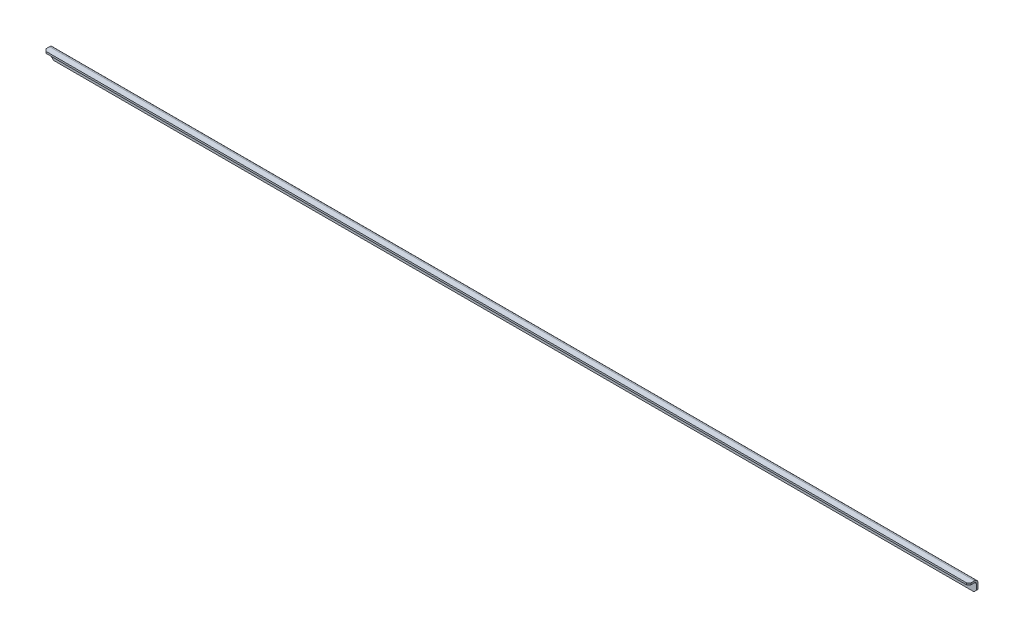
ISO-10303-21;
HEADER;
FILE_DESCRIPTION(('STEP AP214'),'2;1');
FILE_NAME('part.step','',(''),(''),'','','');
FILE_SCHEMA(('AUTOMOTIVE_DESIGN { 1 0 10303 214 1 1 1 1 }'));
ENDSEC;
DATA;
#1=APPLICATION_CONTEXT('core data for automotive mechanical design processes');
#2=APPLICATION_PROTOCOL_DEFINITION('international standard','automotive_design',2000,#1);
#3=PRODUCT_CONTEXT('',#1,'mechanical');
#4=PRODUCT('Part','Part','',(#3));
#5=PRODUCT_RELATED_PRODUCT_CATEGORY('part','',(#4));
#6=PRODUCT_DEFINITION_FORMATION('','',#4);
#7=PRODUCT_DEFINITION_CONTEXT('part definition',#1,'design');
#8=PRODUCT_DEFINITION('design','',#6,#7);
#9=PRODUCT_DEFINITION_SHAPE('','',#8);
#10=(LENGTH_UNIT() NAMED_UNIT(*) SI_UNIT(.MILLI.,.METRE.));
#11=(NAMED_UNIT(*) PLANE_ANGLE_UNIT() SI_UNIT($,.RADIAN.));
#12=(NAMED_UNIT(*) SI_UNIT($,.STERADIAN.) SOLID_ANGLE_UNIT());
#13=UNCERTAINTY_MEASURE_WITH_UNIT(LENGTH_MEASURE(1.E-05),#10,'distance_accuracy_value','');
#14=(GEOMETRIC_REPRESENTATION_CONTEXT(3) GLOBAL_UNCERTAINTY_ASSIGNED_CONTEXT((#13)) GLOBAL_UNIT_ASSIGNED_CONTEXT((#10,
#11,#12)) REPRESENTATION_CONTEXT('',''));
#15=CARTESIAN_POINT('',(0.,0.,0.));
#16=DIRECTION('',(0.,0.,1.));
#17=DIRECTION('',(1.,0.,0.));
#18=AXIS2_PLACEMENT_3D('',#15,#16,#17);
#19=CARTESIAN_POINT('',(800.,0.,1.5));
#20=DIRECTION('',(0.,1.,0.));
#21=DIRECTION('',(0.,0.,1.));
#22=AXIS2_PLACEMENT_3D('',#19,#20,#21);
#23=PLANE('',#22);
#24=DIRECTION('',(-1.,0.,0.));
#25=VECTOR('',#24,1.);
#26=CARTESIAN_POINT('',(800.,0.,0.));
#27=LINE('',#26,#25);
#28=CARTESIAN_POINT('',(798.,0.,0.));
#29=VERTEX_POINT('',#28);
#30=CARTESIAN_POINT('',(2.00000000000025,0.,0.));
#31=VERTEX_POINT('',#30);
#32=EDGE_CURVE('E140',#29,#31,#27,.T.);
#33=ORIENTED_EDGE('',*,*,#32,.F.);
#34=DIRECTION('',(0.,0.,1.));
#35=VECTOR('',#34,1.);
#36=CARTESIAN_POINT('',(798.,0.,1.5));
#37=LINE('',#36,#35);
#38=CARTESIAN_POINT('',(798.,0.,1.5));
#39=VERTEX_POINT('',#38);
#40=EDGE_CURVE('E195',#29,#39,#37,.T.);
#41=ORIENTED_EDGE('',*,*,#40,.T.);
#42=DIRECTION('',(-1.,0.,0.));
#43=VECTOR('',#42,1.);
#44=CARTESIAN_POINT('',(800.,0.,1.5));
#45=LINE('',#44,#43);
#46=CARTESIAN_POINT('',(2.00000000000025,0.,1.5));
#47=VERTEX_POINT('',#46);
#48=EDGE_CURVE('E157',#39,#47,#45,.T.);
#49=ORIENTED_EDGE('',*,*,#48,.T.);
#50=DIRECTION('',(0.,0.,-1.));
#51=VECTOR('',#50,1.);
#52=CARTESIAN_POINT('',(2.,0.,1.5));
#53=LINE('',#52,#51);
#54=EDGE_CURVE('E192',#47,#31,#53,.T.);
#55=ORIENTED_EDGE('',*,*,#54,.T.);
#56=EDGE_LOOP('',(#33,#41,#49,#55));
#57=FACE_BOUND('',#56,.T.);
#58=ADVANCED_FACE('F34',(#57),#23,.F.);
#59=CARTESIAN_POINT('',(800.,0.,0.));
#60=DIRECTION('',(0.,0.,1.));
#61=DIRECTION('',(1.,0.,0.));
#62=AXIS2_PLACEMENT_3D('',#59,#60,#61);
#63=PLANE('',#62);
#64=DIRECTION('',(0.,1.,0.));
#65=VECTOR('',#64,1.);
#66=CARTESIAN_POINT('',(800.,0.,0.));
#67=LINE('',#66,#65);
#68=CARTESIAN_POINT('',(800.,2.,0.));
#69=VERTEX_POINT('',#68);
#70=CARTESIAN_POINT('',(800.,7.,0.));
#71=VERTEX_POINT('',#70);
#72=EDGE_CURVE('E156',#69,#71,#67,.T.);
#73=ORIENTED_EDGE('',*,*,#72,.F.);
#74=DIRECTION('',(-0.707106781186567,-0.707106781186528,0.));
#75=VECTOR('',#74,1.);
#76=CARTESIAN_POINT('',(800.,2.,0.));
#77=LINE('',#76,#75);
#78=EDGE_CURVE('E190',#69,#29,#77,.T.);
#79=ORIENTED_EDGE('',*,*,#78,.T.);
#80=ORIENTED_EDGE('',*,*,#32,.T.);
#81=DIRECTION('',(0.707106781186528,-0.707106781186567,0.));
#82=VECTOR('',#81,1.);
#83=CARTESIAN_POINT('',(2.,0.,0.));
#84=LINE('',#83,#82);
#85=CARTESIAN_POINT('',(0.,2.00000000000011,0.));
#86=VERTEX_POINT('',#85);
#87=EDGE_CURVE('E188',#31,#86,#84,.F.);
#88=ORIENTED_EDGE('',*,*,#87,.T.);
#89=DIRECTION('',(0.,1.,0.));
#90=VECTOR('',#89,1.);
#91=CARTESIAN_POINT('',(0.,0.,0.));
#92=LINE('',#91,#90);
#93=CARTESIAN_POINT('',(0.,7.,0.));
#94=VERTEX_POINT('',#93);
#95=EDGE_CURVE('E147',#86,#94,#92,.T.);
#96=ORIENTED_EDGE('',*,*,#95,.T.);
#97=DIRECTION('',(-1.,0.,0.));
#98=VECTOR('',#97,1.);
#99=CARTESIAN_POINT('',(800.,7.,0.));
#100=LINE('',#99,#98);
#101=EDGE_CURVE('E130',#94,#71,#100,.F.);
#102=ORIENTED_EDGE('',*,*,#101,.T.);
#103=EDGE_LOOP('',(#73,#79,#80,#88,#96,#102));
#104=FACE_BOUND('',#103,.T.);
#105=ADVANCED_FACE('F240',(#104),#63,.F.);
#106=CARTESIAN_POINT('',(800.,10.,0.));
#107=DIRECTION('',(0.,-1.,0.));
#108=DIRECTION('',(0.,0.,-1.));
#109=AXIS2_PLACEMENT_3D('',#106,#107,#108);
#110=PLANE('',#109);
#111=DIRECTION('',(-1.,0.,0.));
#112=VECTOR('',#111,1.);
#113=CARTESIAN_POINT('',(800.,10.,7.99999999999999));
#114=LINE('',#113,#112);
#115=CARTESIAN_POINT('',(798.,10.,7.99999999999999));
#116=VERTEX_POINT('',#115);
#117=CARTESIAN_POINT('',(2.00000000000025,10.,8.00000000000008));
#118=VERTEX_POINT('',#117);
#119=EDGE_CURVE('E164',#116,#118,#114,.T.);
#120=ORIENTED_EDGE('',*,*,#119,.F.);
#121=DIRECTION('',(0.707106781186567,0.,-0.707106781186528));
#122=VECTOR('',#121,1.);
#123=CARTESIAN_POINT('',(800.,10.,5.99999999999999));
#124=LINE('',#123,#122);
#125=CARTESIAN_POINT('',(800.,10.,5.99999999999999));
#126=VERTEX_POINT('',#125);
#127=EDGE_CURVE('E11',#116,#126,#124,.T.);
#128=ORIENTED_EDGE('',*,*,#127,.T.);
#129=DIRECTION('',(0.,0.,1.));
#130=VECTOR('',#129,1.);
#131=CARTESIAN_POINT('',(800.,10.,0.));
#132=LINE('',#131,#130);
#133=CARTESIAN_POINT('',(800.,10.,3.));
#134=VERTEX_POINT('',#133);
#135=EDGE_CURVE('E139',#134,#126,#132,.T.);
#136=ORIENTED_EDGE('',*,*,#135,.F.);
#137=DIRECTION('',(-1.,0.,0.));
#138=VECTOR('',#137,1.);
#139=CARTESIAN_POINT('',(800.,10.,3.));
#140=LINE('',#139,#138);
#141=CARTESIAN_POINT('',(0.,10.,3.));
#142=VERTEX_POINT('',#141);
#143=EDGE_CURVE('E128',#134,#142,#140,.T.);
#144=ORIENTED_EDGE('',*,*,#143,.T.);
#145=DIRECTION('',(0.,0.,1.));
#146=VECTOR('',#145,1.);
#147=CARTESIAN_POINT('',(0.,10.,0.));
#148=LINE('',#147,#146);
#149=CARTESIAN_POINT('',(0.,10.,5.99999999999988));
#150=VERTEX_POINT('',#149);
#151=EDGE_CURVE('E137',#142,#150,#148,.T.);
#152=ORIENTED_EDGE('',*,*,#151,.T.);
#153=DIRECTION('',(-0.707106781186528,0.,-0.707106781186567));
#154=VECTOR('',#153,1.);
#155=CARTESIAN_POINT('',(2.,10.,7.99999999999999));
#156=LINE('',#155,#154);
#157=EDGE_CURVE('E42',#150,#118,#156,.F.);
#158=ORIENTED_EDGE('',*,*,#157,.T.);
#159=EDGE_LOOP('',(#120,#128,#136,#144,#152,#158));
#160=FACE_BOUND('',#159,.T.);
#161=ADVANCED_FACE('F136',(#160),#110,.F.);
#162=CARTESIAN_POINT('',(800.,10.,7.99999999999999));
#163=DIRECTION('',(0.,0.,-1.));
#164=DIRECTION('',(-1.,0.,0.));
#165=AXIS2_PLACEMENT_3D('',#162,#163,#164);
#166=PLANE('',#165);
#167=DIRECTION('',(-1.,0.,0.));
#168=VECTOR('',#167,1.);
#169=CARTESIAN_POINT('',(800.,8.49999999999999,7.99999999999999));
#170=LINE('',#169,#168);
#171=CARTESIAN_POINT('',(798.,8.49999999999999,7.99999999999999));
#172=VERTEX_POINT('',#171);
#173=CARTESIAN_POINT('',(2.00000000000025,8.49999999999999,8.00000000000008));
#174=VERTEX_POINT('',#173);
#175=EDGE_CURVE('E160',#172,#174,#170,.T.);
#176=ORIENTED_EDGE('',*,*,#175,.F.);
#177=DIRECTION('',(0.,1.,0.));
#178=VECTOR('',#177,1.);
#179=CARTESIAN_POINT('',(798.,10.,7.99999999999999));
#180=LINE('',#179,#178);
#181=EDGE_CURVE('E55',#172,#116,#180,.T.);
#182=ORIENTED_EDGE('',*,*,#181,.T.);
#183=ORIENTED_EDGE('',*,*,#119,.T.);
#184=DIRECTION('',(0.,-1.,0.));
#185=VECTOR('',#184,1.);
#186=CARTESIAN_POINT('',(2.,10.,7.99999999999999));
#187=LINE('',#186,#185);
#188=EDGE_CURVE('E208',#118,#174,#187,.T.);
#189=ORIENTED_EDGE('',*,*,#188,.T.);
#190=EDGE_LOOP('',(#176,#182,#183,#189));
#191=FACE_BOUND('',#190,.T.);
#192=ADVANCED_FACE('F212',(#191),#166,.F.);
#193=CARTESIAN_POINT('',(800.,8.49999999999999,7.99999999999999));
#194=DIRECTION('',(0.,1.,0.));
#195=DIRECTION('',(0.,0.,1.));
#196=AXIS2_PLACEMENT_3D('',#193,#194,#195);
#197=PLANE('',#196);
#198=DIRECTION('',(0.,0.,-1.));
#199=VECTOR('',#198,1.);
#200=CARTESIAN_POINT('',(800.,8.49999999999999,7.99999999999999));
#201=LINE('',#200,#199);
#202=CARTESIAN_POINT('',(800.,8.49999999999999,5.99999999999999));
#203=VERTEX_POINT('',#202);
#204=CARTESIAN_POINT('',(800.,8.49999999999999,3.00000000000001));
#205=VERTEX_POINT('',#204);
#206=EDGE_CURVE('E217',#203,#205,#201,.T.);
#207=ORIENTED_EDGE('',*,*,#206,.F.);
#208=DIRECTION('',(-0.707106781186567,0.,0.707106781186528));
#209=VECTOR('',#208,1.);
#210=CARTESIAN_POINT('',(800.,8.49999999999999,5.99999999999999));
#211=LINE('',#210,#209);
#212=EDGE_CURVE('E206',#203,#172,#211,.T.);
#213=ORIENTED_EDGE('',*,*,#212,.T.);
#214=ORIENTED_EDGE('',*,*,#175,.T.);
#215=DIRECTION('',(0.707106781186528,0.,0.707106781186567));
#216=VECTOR('',#215,1.);
#217=CARTESIAN_POINT('',(2.,8.49999999999999,7.99999999999999));
#218=LINE('',#217,#216);
#219=CARTESIAN_POINT('',(0.,8.49999999999999,5.99999999999988));
#220=VERTEX_POINT('',#219);
#221=EDGE_CURVE('E204',#174,#220,#218,.F.);
#222=ORIENTED_EDGE('',*,*,#221,.T.);
#223=DIRECTION('',(0.,0.,-1.));
#224=VECTOR('',#223,1.);
#225=CARTESIAN_POINT('',(0.,8.49999999999999,7.99999999999999));
#226=LINE('',#225,#224);
#227=CARTESIAN_POINT('',(0.,8.49999999999999,3.00000000000001));
#228=VERTEX_POINT('',#227);
#229=EDGE_CURVE('E146',#220,#228,#226,.T.);
#230=ORIENTED_EDGE('',*,*,#229,.T.);
#231=DIRECTION('',(-1.,0.,0.));
#232=VECTOR('',#231,1.);
#233=CARTESIAN_POINT('',(800.,8.49999999999999,3.00000000000001));
#234=LINE('',#233,#232);
#235=EDGE_CURVE('E174',#228,#205,#234,.F.);
#236=ORIENTED_EDGE('',*,*,#235,.T.);
#237=EDGE_LOOP('',(#207,#213,#214,#222,#230,#236));
#238=FACE_BOUND('',#237,.T.);
#239=ADVANCED_FACE('F216',(#238),#197,.F.);
#240=CARTESIAN_POINT('',(800.,8.49999999999999,1.50000000000001));
#241=DIRECTION('',(0.,0.,-1.));
#242=DIRECTION('',(0.,1.,0.));
#243=AXIS2_PLACEMENT_3D('',#240,#241,#242);
#244=PLANE('',#243);
#245=ORIENTED_EDGE('',*,*,#48,.F.);
#246=DIRECTION('',(0.707106781186567,0.707106781186528,0.));
#247=VECTOR('',#246,1.);
#248=CARTESIAN_POINT('',(800.,2.,1.5));
#249=LINE('',#248,#247);
#250=CARTESIAN_POINT('',(800.,2.,1.5));
#251=VERTEX_POINT('',#250);
#252=EDGE_CURVE('E199',#39,#251,#249,.T.);
#253=ORIENTED_EDGE('',*,*,#252,.T.);
#254=DIRECTION('',(0.,-1.,0.));
#255=VECTOR('',#254,1.);
#256=CARTESIAN_POINT('',(800.,8.49999999999999,1.50000000000001));
#257=LINE('',#256,#255);
#258=CARTESIAN_POINT('',(800.,6.99999999999999,1.50000000000001));
#259=VERTEX_POINT('',#258);
#260=EDGE_CURVE('E161',#259,#251,#257,.T.);
#261=ORIENTED_EDGE('',*,*,#260,.F.);
#262=DIRECTION('',(-1.,0.,0.));
#263=VECTOR('',#262,1.);
#264=CARTESIAN_POINT('',(0.,6.99999999999999,1.50000000000001));
#265=LINE('',#264,#263);
#266=CARTESIAN_POINT('',(0.,6.99999999999999,1.50000000000001));
#267=VERTEX_POINT('',#266);
#268=EDGE_CURVE('E171',#259,#267,#265,.T.);
#269=ORIENTED_EDGE('',*,*,#268,.T.);
#270=DIRECTION('',(0.,-1.,0.));
#271=VECTOR('',#270,1.);
#272=CARTESIAN_POINT('',(0.,8.49999999999999,1.50000000000001));
#273=LINE('',#272,#271);
#274=CARTESIAN_POINT('',(0.,2.00000000000011,1.5));
#275=VERTEX_POINT('',#274);
#276=EDGE_CURVE('E149',#267,#275,#273,.T.);
#277=ORIENTED_EDGE('',*,*,#276,.T.);
#278=DIRECTION('',(-0.707106781186528,0.707106781186567,0.));
#279=VECTOR('',#278,1.);
#280=CARTESIAN_POINT('',(2.,0.,1.5));
#281=LINE('',#280,#279);
#282=EDGE_CURVE('E197',#275,#47,#281,.F.);
#283=ORIENTED_EDGE('',*,*,#282,.T.);
#284=EDGE_LOOP('',(#245,#253,#261,#269,#277,#283));
#285=FACE_BOUND('',#284,.T.);
#286=ADVANCED_FACE('F249',(#285),#244,.F.);
#287=CARTESIAN_POINT('',(800.,0.,0.));
#288=DIRECTION('',(1.,0.,0.));
#289=DIRECTION('',(0.,0.,-1.));
#290=AXIS2_PLACEMENT_3D('',#287,#288,#289);
#291=PLANE('',#290);
#292=ORIENTED_EDGE('',*,*,#260,.T.);
#293=DIRECTION('',(0.,0.,-1.));
#294=VECTOR('',#293,1.);
#295=CARTESIAN_POINT('',(800.,2.,0.));
#296=LINE('',#295,#294);
#297=EDGE_CURVE('E185',#251,#69,#296,.T.);
#298=ORIENTED_EDGE('',*,*,#297,.T.);
#299=ORIENTED_EDGE('',*,*,#72,.T.);
#300=CARTESIAN_POINT('',(800.,7.,3.));
#301=DIRECTION('',(1.,0.,0.));
#302=DIRECTION('',(0.,0.,-1.));
#303=AXIS2_PLACEMENT_3D('',#300,#301,#302);
#304=CIRCLE('',#303,3.);
#305=EDGE_CURVE('E169',#71,#134,#304,.T.);
#306=ORIENTED_EDGE('',*,*,#305,.T.);
#307=ORIENTED_EDGE('',*,*,#135,.T.);
#308=DIRECTION('',(0.,-1.,0.));
#309=VECTOR('',#308,1.);
#310=CARTESIAN_POINT('',(800.,8.49999999999999,5.99999999999999));
#311=LINE('',#310,#309);
#312=EDGE_CURVE('E182',#126,#203,#311,.T.);
#313=ORIENTED_EDGE('',*,*,#312,.T.);
#314=ORIENTED_EDGE('',*,*,#206,.T.);
#315=CARTESIAN_POINT('',(800.,6.99999999999999,3.00000000000001));
#316=DIRECTION('',(1.,0.,0.));
#317=DIRECTION('',(0.,0.,-1.));
#318=AXIS2_PLACEMENT_3D('',#315,#316,#317);
#319=CIRCLE('',#318,1.5);
#320=EDGE_CURVE('E180',#205,#259,#319,.F.);
#321=ORIENTED_EDGE('',*,*,#320,.T.);
#322=EDGE_LOOP('',(#292,#298,#299,#306,#307,#313,#314,#321));
#323=FACE_BOUND('',#322,.T.);
#324=ADVANCED_FACE('F224',(#323),#291,.T.);
#325=CARTESIAN_POINT('',(0.,0.,0.));
#326=DIRECTION('',(1.,0.,0.));
#327=DIRECTION('',(0.,0.,-1.));
#328=AXIS2_PLACEMENT_3D('',#325,#326,#327);
#329=PLANE('',#328);
#330=ORIENTED_EDGE('',*,*,#95,.F.);
#331=DIRECTION('',(0.,0.,1.));
#332=VECTOR('',#331,1.);
#333=CARTESIAN_POINT('',(0.,2.00000000000011,0.));
#334=LINE('',#333,#332);
#335=EDGE_CURVE('E202',#86,#275,#334,.T.);
#336=ORIENTED_EDGE('',*,*,#335,.T.);
#337=ORIENTED_EDGE('',*,*,#276,.F.);
#338=CARTESIAN_POINT('',(0.,6.99999999999999,3.00000000000001));
#339=DIRECTION('',(1.,0.,0.));
#340=DIRECTION('',(0.,0.,-1.));
#341=AXIS2_PLACEMENT_3D('',#338,#339,#340);
#342=CIRCLE('',#341,1.5);
#343=EDGE_CURVE('E177',#267,#228,#342,.T.);
#344=ORIENTED_EDGE('',*,*,#343,.T.);
#345=ORIENTED_EDGE('',*,*,#229,.F.);
#346=DIRECTION('',(0.,1.,0.));
#347=VECTOR('',#346,1.);
#348=CARTESIAN_POINT('',(0.,0.,5.99999999999988));
#349=LINE('',#348,#347);
#350=EDGE_CURVE('E145',#220,#150,#349,.T.);
#351=ORIENTED_EDGE('',*,*,#350,.T.);
#352=ORIENTED_EDGE('',*,*,#151,.F.);
#353=CARTESIAN_POINT('',(0.,7.,3.));
#354=DIRECTION('',(1.,0.,0.));
#355=DIRECTION('',(0.,0.,-1.));
#356=AXIS2_PLACEMENT_3D('',#353,#354,#355);
#357=CIRCLE('',#356,3.);
#358=EDGE_CURVE('E124',#142,#94,#357,.F.);
#359=ORIENTED_EDGE('',*,*,#358,.T.);
#360=EDGE_LOOP('',(#330,#336,#337,#344,#345,#351,#352,#359));
#361=FACE_BOUND('',#360,.T.);
#362=ADVANCED_FACE('F142',(#361),#329,.F.);
#363=CARTESIAN_POINT('',(800.,7.,3.));
#364=DIRECTION('',(-1.,0.,0.));
#365=DIRECTION('',(0.,0.,1.));
#366=AXIS2_PLACEMENT_3D('',#363,#364,#365);
#367=CYLINDRICAL_SURFACE('',#366,3.);
#368=ORIENTED_EDGE('',*,*,#305,.F.);
#369=ORIENTED_EDGE('',*,*,#101,.F.);
#370=ORIENTED_EDGE('',*,*,#358,.F.);
#371=ORIENTED_EDGE('',*,*,#143,.F.);
#372=EDGE_LOOP('',(#368,#369,#370,#371));
#373=FACE_BOUND('',#372,.T.);
#374=ADVANCED_FACE('F127',(#373),#367,.T.);
#375=CARTESIAN_POINT('',(800.,6.99999999999999,3.00000000000001));
#376=DIRECTION('',(1.,0.,0.));
#377=DIRECTION('',(0.,0.,-1.));
#378=AXIS2_PLACEMENT_3D('',#375,#376,#377);
#379=CYLINDRICAL_SURFACE('',#378,1.5);
#380=ORIENTED_EDGE('',*,*,#320,.F.);
#381=ORIENTED_EDGE('',*,*,#235,.F.);
#382=ORIENTED_EDGE('',*,*,#343,.F.);
#383=ORIENTED_EDGE('',*,*,#268,.F.);
#384=EDGE_LOOP('',(#380,#381,#382,#383));
#385=FACE_BOUND('',#384,.T.);
#386=ADVANCED_FACE('F251',(#385),#379,.F.);
#387=CARTESIAN_POINT('',(800.,2.,0.));
#388=DIRECTION('',(0.707106781186528,-0.707106781186567,0.));
#389=DIRECTION('',(0.,0.,1.));
#390=AXIS2_PLACEMENT_3D('',#387,#388,#389);
#391=PLANE('',#390);
#392=ORIENTED_EDGE('',*,*,#252,.F.);
#393=ORIENTED_EDGE('',*,*,#40,.F.);
#394=ORIENTED_EDGE('',*,*,#78,.F.);
#395=ORIENTED_EDGE('',*,*,#297,.F.);
#396=EDGE_LOOP('',(#392,#393,#394,#395));
#397=FACE_BOUND('',#396,.T.);
#398=ADVANCED_FACE('F236',(#397),#391,.T.);
#399=CARTESIAN_POINT('',(2.,0.,1.5));
#400=DIRECTION('',(0.707106781186567,0.707106781186528,0.));
#401=DIRECTION('',(0.,0.,-1.));
#402=AXIS2_PLACEMENT_3D('',#399,#400,#401);
#403=PLANE('',#402);
#404=ORIENTED_EDGE('',*,*,#282,.F.);
#405=ORIENTED_EDGE('',*,*,#335,.F.);
#406=ORIENTED_EDGE('',*,*,#87,.F.);
#407=ORIENTED_EDGE('',*,*,#54,.F.);
#408=EDGE_LOOP('',(#404,#405,#406,#407));
#409=FACE_BOUND('',#408,.T.);
#410=ADVANCED_FACE('F246',(#409),#403,.F.);
#411=CARTESIAN_POINT('',(800.,0.,5.99999999999999));
#412=DIRECTION('',(0.707106781186528,0.,0.707106781186567));
#413=DIRECTION('',(0.,1.,0.));
#414=AXIS2_PLACEMENT_3D('',#411,#412,#413);
#415=PLANE('',#414);
#416=ORIENTED_EDGE('',*,*,#127,.F.);
#417=ORIENTED_EDGE('',*,*,#181,.F.);
#418=ORIENTED_EDGE('',*,*,#212,.F.);
#419=ORIENTED_EDGE('',*,*,#312,.F.);
#420=EDGE_LOOP('',(#416,#417,#418,#419));
#421=FACE_BOUND('',#420,.T.);
#422=ADVANCED_FACE('F221',(#421),#415,.T.);
#423=CARTESIAN_POINT('',(2.,10.,7.99999999999999));
#424=DIRECTION('',(0.707106781186567,0.,-0.707106781186528));
#425=DIRECTION('',(0.,-1.,0.));
#426=AXIS2_PLACEMENT_3D('',#423,#424,#425);
#427=PLANE('',#426);
#428=ORIENTED_EDGE('',*,*,#157,.F.);
#429=ORIENTED_EDGE('',*,*,#350,.F.);
#430=ORIENTED_EDGE('',*,*,#221,.F.);
#431=ORIENTED_EDGE('',*,*,#188,.F.);
#432=EDGE_LOOP('',(#428,#429,#430,#431));
#433=FACE_BOUND('',#432,.T.);
#434=ADVANCED_FACE('F36',(#433),#427,.F.);
#435=CLOSED_SHELL('',(#58,#105,#161,#192,#239,#286,#324,#362,#374,#386,#398,#410,#422,#434));
#436=MANIFOLD_SOLID_BREP('B2',#435);
#437=ADVANCED_BREP_SHAPE_REPRESENTATION('',(#18,#436),#14);
#438=SHAPE_DEFINITION_REPRESENTATION(#9,#437);
ENDSEC;
END-ISO-10303-21;
